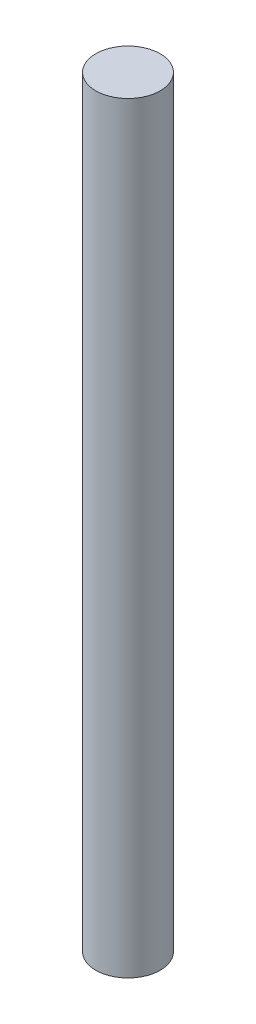
ISO-10303-21;
HEADER;
FILE_DESCRIPTION(('STEP AP214'),'2;1');
FILE_NAME('part.step','',(''),(''),'','','');
FILE_SCHEMA(('AUTOMOTIVE_DESIGN { 1 0 10303 214 1 1 1 1 }'));
ENDSEC;
DATA;
#1=APPLICATION_CONTEXT('core data for automotive mechanical design processes');
#2=APPLICATION_PROTOCOL_DEFINITION('international standard','automotive_design',2000,#1);
#3=PRODUCT_CONTEXT('',#1,'mechanical');
#4=PRODUCT('Part','Part','',(#3));
#5=PRODUCT_RELATED_PRODUCT_CATEGORY('part','',(#4));
#6=PRODUCT_DEFINITION_FORMATION('','',#4);
#7=PRODUCT_DEFINITION_CONTEXT('part definition',#1,'design');
#8=PRODUCT_DEFINITION('design','',#6,#7);
#9=PRODUCT_DEFINITION_SHAPE('','',#8);
#10=(LENGTH_UNIT() NAMED_UNIT(*) SI_UNIT(.MILLI.,.METRE.));
#11=(NAMED_UNIT(*) PLANE_ANGLE_UNIT() SI_UNIT($,.RADIAN.));
#12=(NAMED_UNIT(*) SI_UNIT($,.STERADIAN.) SOLID_ANGLE_UNIT());
#13=UNCERTAINTY_MEASURE_WITH_UNIT(LENGTH_MEASURE(1.E-05),#10,'distance_accuracy_value','');
#14=(GEOMETRIC_REPRESENTATION_CONTEXT(3) GLOBAL_UNCERTAINTY_ASSIGNED_CONTEXT((#13)) GLOBAL_UNIT_ASSIGNED_CONTEXT((#10,
#11,#12)) REPRESENTATION_CONTEXT('',''));
#15=CARTESIAN_POINT('',(0.,0.,0.));
#16=DIRECTION('',(0.,0.,1.));
#17=DIRECTION('',(1.,0.,0.));
#18=AXIS2_PLACEMENT_3D('',#15,#16,#17);
#19=CARTESIAN_POINT('',(0.,47.,0.));
#20=DIRECTION('',(0.,-1.,0.));
#21=DIRECTION('',(0.,0.,-1.));
#22=AXIS2_PLACEMENT_3D('',#19,#20,#21);
#23=CYLINDRICAL_SURFACE('',#22,1.985);
#24=CARTESIAN_POINT('',(0.,47.,0.));
#25=DIRECTION('',(0.,1.,0.));
#26=DIRECTION('',(0.,0.,1.));
#27=AXIS2_PLACEMENT_3D('',#24,#25,#26);
#28=CIRCLE('',#27,1.985);
#29=CARTESIAN_POINT('',(0.,47.,1.985));
#30=VERTEX_POINT('',#29);
#31=EDGE_CURVE('E10',#30,#30,#28,.T.);
#32=ORIENTED_EDGE('',*,*,#31,.F.);
#33=EDGE_LOOP('',(#32));
#34=FACE_BOUND('',#33,.T.);
#35=CARTESIAN_POINT('',(0.,0.,0.));
#36=DIRECTION('',(0.,1.,0.));
#37=DIRECTION('',(0.,0.,1.));
#38=AXIS2_PLACEMENT_3D('',#35,#36,#37);
#39=CIRCLE('',#38,1.985);
#40=CARTESIAN_POINT('',(0.,0.,1.985));
#41=VERTEX_POINT('',#40);
#42=EDGE_CURVE('E46',#41,#41,#39,.T.);
#43=ORIENTED_EDGE('',*,*,#42,.T.);
#44=EDGE_LOOP('',(#43));
#45=FACE_BOUND('',#44,.T.);
#46=ADVANCED_FACE('F43',(#34,#45),#23,.T.);
#47=CARTESIAN_POINT('',(0.,47.,0.));
#48=DIRECTION('',(0.,1.,0.));
#49=DIRECTION('',(0.,0.,1.));
#50=AXIS2_PLACEMENT_3D('',#47,#48,#49);
#51=PLANE('',#50);
#52=ORIENTED_EDGE('',*,*,#31,.T.);
#53=EDGE_LOOP('',(#52));
#54=FACE_BOUND('',#53,.T.);
#55=ADVANCED_FACE('F60',(#54),#51,.T.);
#56=CARTESIAN_POINT('',(0.,0.,0.));
#57=DIRECTION('',(0.,1.,0.));
#58=DIRECTION('',(0.,0.,1.));
#59=AXIS2_PLACEMENT_3D('',#56,#57,#58);
#60=PLANE('',#59);
#61=ORIENTED_EDGE('',*,*,#42,.F.);
#62=EDGE_LOOP('',(#61));
#63=FACE_BOUND('',#62,.T.);
#64=ADVANCED_FACE('F58',(#63),#60,.F.);
#65=CLOSED_SHELL('',(#46,#55,#64));
#66=MANIFOLD_SOLID_BREP('B2',#65);
#67=ADVANCED_BREP_SHAPE_REPRESENTATION('',(#18,#66),#14);
#68=SHAPE_DEFINITION_REPRESENTATION(#9,#67);
ENDSEC;
END-ISO-10303-21;
